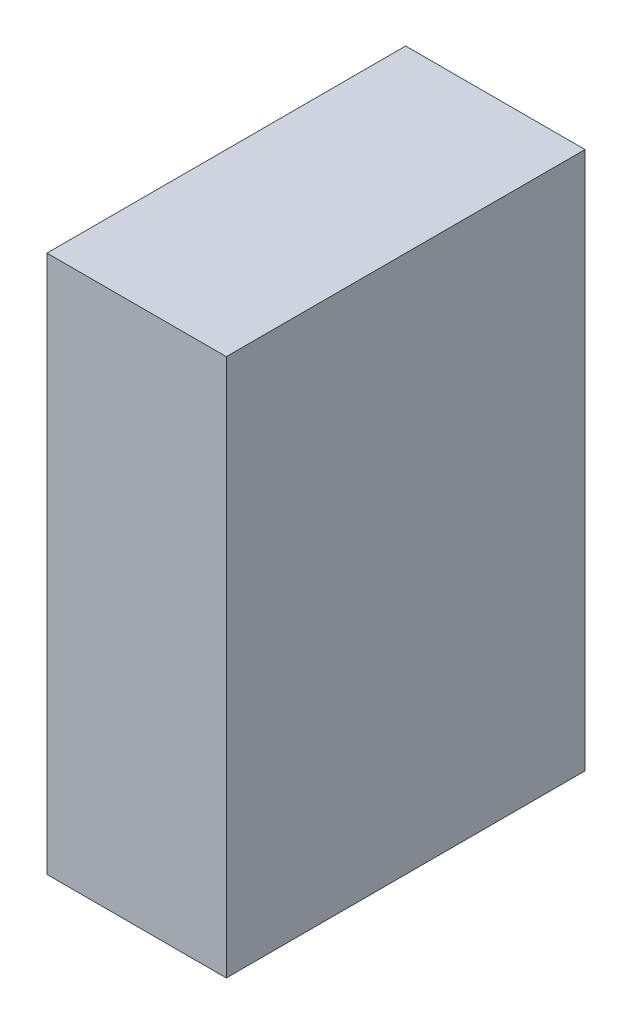
ISO-10303-21;
HEADER;
FILE_DESCRIPTION(('STEP AP214'),'2;1');
FILE_NAME('part.step','',(''),(''),'','','');
FILE_SCHEMA(('AUTOMOTIVE_DESIGN { 1 0 10303 214 1 1 1 1 }'));
ENDSEC;
DATA;
#1=APPLICATION_CONTEXT('core data for automotive mechanical design processes');
#2=APPLICATION_PROTOCOL_DEFINITION('international standard','automotive_design',2000,#1);
#3=PRODUCT_CONTEXT('',#1,'mechanical');
#4=PRODUCT('Part','Part','',(#3));
#5=PRODUCT_RELATED_PRODUCT_CATEGORY('part','',(#4));
#6=PRODUCT_DEFINITION_FORMATION('','',#4);
#7=PRODUCT_DEFINITION_CONTEXT('part definition',#1,'design');
#8=PRODUCT_DEFINITION('design','',#6,#7);
#9=PRODUCT_DEFINITION_SHAPE('','',#8);
#10=(LENGTH_UNIT() NAMED_UNIT(*) SI_UNIT(.MILLI.,.METRE.));
#11=(NAMED_UNIT(*) PLANE_ANGLE_UNIT() SI_UNIT($,.RADIAN.));
#12=(NAMED_UNIT(*) SI_UNIT($,.STERADIAN.) SOLID_ANGLE_UNIT());
#13=UNCERTAINTY_MEASURE_WITH_UNIT(LENGTH_MEASURE(1.E-05),#10,'distance_accuracy_value','');
#14=(GEOMETRIC_REPRESENTATION_CONTEXT(3) GLOBAL_UNCERTAINTY_ASSIGNED_CONTEXT((#13)) GLOBAL_UNIT_ASSIGNED_CONTEXT((#10,
#11,#12)) REPRESENTATION_CONTEXT('',''));
#15=CARTESIAN_POINT('',(0.,0.,0.));
#16=DIRECTION('',(0.,0.,1.));
#17=DIRECTION('',(1.,0.,0.));
#18=AXIS2_PLACEMENT_3D('',#15,#16,#17);
#19=CARTESIAN_POINT('',(0.,38.1,0.));
#20=DIRECTION('',(1.,0.,0.));
#21=DIRECTION('',(0.,0.,-1.));
#22=AXIS2_PLACEMENT_3D('',#19,#20,#21);
#23=PLANE('',#22);
#24=DIRECTION('',(0.,0.,1.));
#25=VECTOR('',#24,1.);
#26=CARTESIAN_POINT('',(0.,0.,0.));
#27=LINE('',#26,#25);
#28=CARTESIAN_POINT('',(0.,0.,-25.4));
#29=VERTEX_POINT('',#28);
#30=CARTESIAN_POINT('',(0.,0.,0.));
#31=VERTEX_POINT('',#30);
#32=EDGE_CURVE('E95',#29,#31,#27,.T.);
#33=ORIENTED_EDGE('',*,*,#32,.T.);
#34=DIRECTION('',(0.,-1.,0.));
#35=VECTOR('',#34,1.);
#36=CARTESIAN_POINT('',(0.,38.1,0.));
#37=LINE('',#36,#35);
#38=CARTESIAN_POINT('',(0.,38.1,0.));
#39=VERTEX_POINT('',#38);
#40=EDGE_CURVE('E11',#39,#31,#37,.T.);
#41=ORIENTED_EDGE('',*,*,#40,.F.);
#42=DIRECTION('',(0.,0.,1.));
#43=VECTOR('',#42,1.);
#44=CARTESIAN_POINT('',(0.,38.1,0.));
#45=LINE('',#44,#43);
#46=CARTESIAN_POINT('',(0.,38.1,-25.4));
#47=VERTEX_POINT('',#46);
#48=EDGE_CURVE('E83',#47,#39,#45,.T.);
#49=ORIENTED_EDGE('',*,*,#48,.F.);
#50=DIRECTION('',(0.,-1.,0.));
#51=VECTOR('',#50,1.);
#52=CARTESIAN_POINT('',(0.,38.1,-25.4));
#53=LINE('',#52,#51);
#54=EDGE_CURVE('E91',#47,#29,#53,.T.);
#55=ORIENTED_EDGE('',*,*,#54,.T.);
#56=EDGE_LOOP('',(#33,#41,#49,#55));
#57=FACE_BOUND('',#56,.T.);
#58=ADVANCED_FACE('F32',(#57),#23,.F.);
#59=CARTESIAN_POINT('',(0.,38.1,0.));
#60=DIRECTION('',(0.,0.,-1.));
#61=DIRECTION('',(-1.,0.,0.));
#62=AXIS2_PLACEMENT_3D('',#59,#60,#61);
#63=PLANE('',#62);
#64=DIRECTION('',(1.,0.,0.));
#65=VECTOR('',#64,1.);
#66=CARTESIAN_POINT('',(0.,0.,0.));
#67=LINE('',#66,#65);
#68=CARTESIAN_POINT('',(12.7,0.,0.));
#69=VERTEX_POINT('',#68);
#70=EDGE_CURVE('E87',#31,#69,#67,.T.);
#71=ORIENTED_EDGE('',*,*,#70,.T.);
#72=DIRECTION('',(0.,-1.,0.));
#73=VECTOR('',#72,1.);
#74=CARTESIAN_POINT('',(12.7,38.1,0.));
#75=LINE('',#74,#73);
#76=CARTESIAN_POINT('',(12.7,38.1,0.));
#77=VERTEX_POINT('',#76);
#78=EDGE_CURVE('E40',#77,#69,#75,.T.);
#79=ORIENTED_EDGE('',*,*,#78,.F.);
#80=DIRECTION('',(1.,0.,0.));
#81=VECTOR('',#80,1.);
#82=CARTESIAN_POINT('',(0.,38.1,0.));
#83=LINE('',#82,#81);
#84=EDGE_CURVE('E78',#39,#77,#83,.T.);
#85=ORIENTED_EDGE('',*,*,#84,.F.);
#86=ORIENTED_EDGE('',*,*,#40,.T.);
#87=EDGE_LOOP('',(#71,#79,#85,#86));
#88=FACE_BOUND('',#87,.T.);
#89=ADVANCED_FACE('F86',(#88),#63,.F.);
#90=CARTESIAN_POINT('',(12.7,38.1,0.));
#91=DIRECTION('',(-1.,0.,0.));
#92=DIRECTION('',(0.,0.,1.));
#93=AXIS2_PLACEMENT_3D('',#90,#91,#92);
#94=PLANE('',#93);
#95=DIRECTION('',(0.,0.,-1.));
#96=VECTOR('',#95,1.);
#97=CARTESIAN_POINT('',(12.7,0.,0.));
#98=LINE('',#97,#96);
#99=CARTESIAN_POINT('',(12.7,0.,-25.4));
#100=VERTEX_POINT('',#99);
#101=EDGE_CURVE('E65',#69,#100,#98,.T.);
#102=ORIENTED_EDGE('',*,*,#101,.T.);
#103=DIRECTION('',(0.,-1.,0.));
#104=VECTOR('',#103,1.);
#105=CARTESIAN_POINT('',(12.7,38.1,-25.4));
#106=LINE('',#105,#104);
#107=CARTESIAN_POINT('',(12.7,38.1,-25.4));
#108=VERTEX_POINT('',#107);
#109=EDGE_CURVE('E88',#108,#100,#106,.T.);
#110=ORIENTED_EDGE('',*,*,#109,.F.);
#111=DIRECTION('',(0.,0.,-1.));
#112=VECTOR('',#111,1.);
#113=CARTESIAN_POINT('',(12.7,38.1,0.));
#114=LINE('',#113,#112);
#115=EDGE_CURVE('E81',#77,#108,#114,.T.);
#116=ORIENTED_EDGE('',*,*,#115,.F.);
#117=ORIENTED_EDGE('',*,*,#78,.T.);
#118=EDGE_LOOP('',(#102,#110,#116,#117));
#119=FACE_BOUND('',#118,.T.);
#120=ADVANCED_FACE('F89',(#119),#94,.F.);
#121=CARTESIAN_POINT('',(0.,38.1,-25.4));
#122=DIRECTION('',(0.,0.,1.));
#123=DIRECTION('',(1.,0.,0.));
#124=AXIS2_PLACEMENT_3D('',#121,#122,#123);
#125=PLANE('',#124);
#126=DIRECTION('',(-1.,0.,0.));
#127=VECTOR('',#126,1.);
#128=CARTESIAN_POINT('',(0.,0.,-25.4));
#129=LINE('',#128,#127);
#130=EDGE_CURVE('E71',#100,#29,#129,.T.);
#131=ORIENTED_EDGE('',*,*,#130,.T.);
#132=ORIENTED_EDGE('',*,*,#54,.F.);
#133=DIRECTION('',(-1.,0.,0.));
#134=VECTOR('',#133,1.);
#135=CARTESIAN_POINT('',(0.,38.1,-25.4));
#136=LINE('',#135,#134);
#137=EDGE_CURVE('E48',#108,#47,#136,.T.);
#138=ORIENTED_EDGE('',*,*,#137,.F.);
#139=ORIENTED_EDGE('',*,*,#109,.T.);
#140=EDGE_LOOP('',(#131,#132,#138,#139));
#141=FACE_BOUND('',#140,.T.);
#142=ADVANCED_FACE('F102',(#141),#125,.F.);
#143=CARTESIAN_POINT('',(0.,38.1,0.));
#144=DIRECTION('',(0.,-1.,0.));
#145=DIRECTION('',(0.,0.,-1.));
#146=AXIS2_PLACEMENT_3D('',#143,#144,#145);
#147=PLANE('',#146);
#148=ORIENTED_EDGE('',*,*,#48,.T.);
#149=ORIENTED_EDGE('',*,*,#84,.T.);
#150=ORIENTED_EDGE('',*,*,#115,.T.);
#151=ORIENTED_EDGE('',*,*,#137,.T.);
#152=EDGE_LOOP('',(#148,#149,#150,#151));
#153=FACE_BOUND('',#152,.T.);
#154=ADVANCED_FACE('F79',(#153),#147,.F.);
#155=CARTESIAN_POINT('',(0.,0.,0.));
#156=DIRECTION('',(0.,-1.,0.));
#157=DIRECTION('',(0.,0.,-1.));
#158=AXIS2_PLACEMENT_3D('',#155,#156,#157);
#159=PLANE('',#158);
#160=ORIENTED_EDGE('',*,*,#32,.F.);
#161=ORIENTED_EDGE('',*,*,#130,.F.);
#162=ORIENTED_EDGE('',*,*,#101,.F.);
#163=ORIENTED_EDGE('',*,*,#70,.F.);
#164=EDGE_LOOP('',(#160,#161,#162,#163));
#165=FACE_BOUND('',#164,.T.);
#166=ADVANCED_FACE('F105',(#165),#159,.T.);
#167=CLOSED_SHELL('',(#58,#89,#120,#142,#154,#166));
#168=MANIFOLD_SOLID_BREP('B2',#167);
#169=ADVANCED_BREP_SHAPE_REPRESENTATION('',(#18,#168),#14);
#170=SHAPE_DEFINITION_REPRESENTATION(#9,#169);
ENDSEC;
END-ISO-10303-21;
